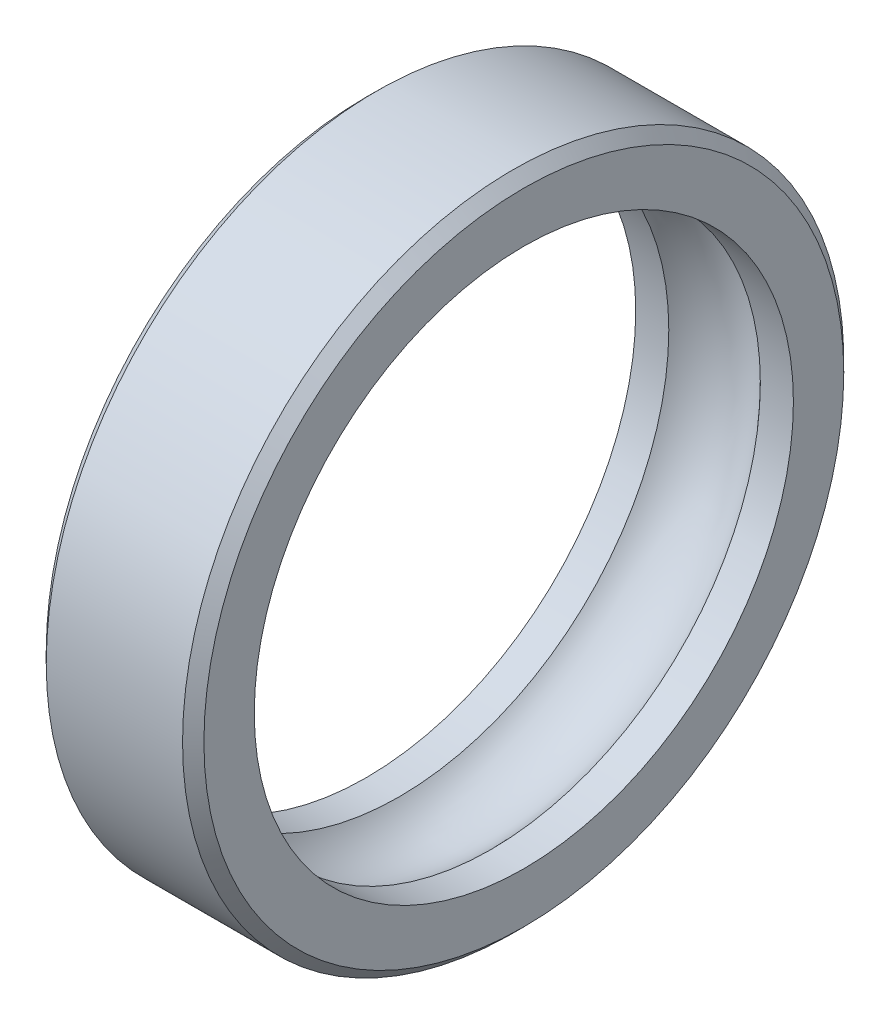
ISO-10303-21;
HEADER;
FILE_DESCRIPTION(('STEP AP214'),'2;1');
FILE_NAME('part.step','',(''),(''),'','','');
FILE_SCHEMA(('AUTOMOTIVE_DESIGN { 1 0 10303 214 1 1 1 1 }'));
ENDSEC;
DATA;
#1=APPLICATION_CONTEXT('core data for automotive mechanical design processes');
#2=APPLICATION_PROTOCOL_DEFINITION('international standard','automotive_design',2000,#1);
#3=PRODUCT_CONTEXT('',#1,'mechanical');
#4=PRODUCT('Part','Part','',(#3));
#5=PRODUCT_RELATED_PRODUCT_CATEGORY('part','',(#4));
#6=PRODUCT_DEFINITION_FORMATION('','',#4);
#7=PRODUCT_DEFINITION_CONTEXT('part definition',#1,'design');
#8=PRODUCT_DEFINITION('design','',#6,#7);
#9=PRODUCT_DEFINITION_SHAPE('','',#8);
#10=(LENGTH_UNIT() NAMED_UNIT(*) SI_UNIT(.MILLI.,.METRE.));
#11=(NAMED_UNIT(*) PLANE_ANGLE_UNIT() SI_UNIT($,.RADIAN.));
#12=(NAMED_UNIT(*) SI_UNIT($,.STERADIAN.) SOLID_ANGLE_UNIT());
#13=UNCERTAINTY_MEASURE_WITH_UNIT(LENGTH_MEASURE(1.E-05),#10,'distance_accuracy_value','');
#14=(GEOMETRIC_REPRESENTATION_CONTEXT(3) GLOBAL_UNCERTAINTY_ASSIGNED_CONTEXT((#13)) GLOBAL_UNIT_ASSIGNED_CONTEXT((#10,
#11,#12)) REPRESENTATION_CONTEXT('',''));
#15=CARTESIAN_POINT('',(0.,0.,0.));
#16=DIRECTION('',(0.,0.,1.));
#17=DIRECTION('',(1.,0.,0.));
#18=AXIS2_PLACEMENT_3D('',#15,#16,#17);
#19=CARTESIAN_POINT('',(-15.1704812516127,65.,0.));
#20=DIRECTION('',(1.,0.,0.));
#21=DIRECTION('',(0.,0.,-1.));
#22=AXIS2_PLACEMENT_3D('',#19,#20,#21);
#23=PLANE('',#22);
#24=CARTESIAN_POINT('',(-15.1704812516127,0.,0.));
#25=DIRECTION('',(1.,0.,0.));
#26=DIRECTION('',(0.,0.,-1.));
#27=AXIS2_PLACEMENT_3D('',#24,#25,#26);
#28=CIRCLE('',#27,62.9);
#29=CARTESIAN_POINT('',(-15.1704812516127,0.,-62.9));
#30=VERTEX_POINT('',#29);
#31=EDGE_CURVE('E10',#30,#30,#28,.F.);
#32=ORIENTED_EDGE('',*,*,#31,.T.);
#33=EDGE_LOOP('',(#32));
#34=FACE_BOUND('',#33,.T.);
#35=CARTESIAN_POINT('',(-15.1704812516127,0.,0.));
#36=DIRECTION('',(-1.,0.,0.));
#37=DIRECTION('',(0.,0.,1.));
#38=AXIS2_PLACEMENT_3D('',#35,#36,#37);
#39=CIRCLE('',#38,53.);
#40=CARTESIAN_POINT('',(-15.1704812516127,0.,53.));
#41=VERTEX_POINT('',#40);
#42=EDGE_CURVE('E68',#41,#41,#39,.T.);
#43=ORIENTED_EDGE('',*,*,#42,.F.);
#44=EDGE_LOOP('',(#43));
#45=FACE_BOUND('',#44,.T.);
#46=ADVANCED_FACE('F39',(#34,#45),#23,.F.);
#47=CARTESIAN_POINT('',(-8.51940617188541,0.,0.));
#48=DIRECTION('',(-1.,0.,0.));
#49=DIRECTION('',(0.,0.,1.));
#50=AXIS2_PLACEMENT_3D('',#47,#48,#49);
#51=CYLINDRICAL_SURFACE('',#50,65.);
#52=CARTESIAN_POINT('',(13.7295187483873,0.,0.));
#53=DIRECTION('',(-1.,0.,0.));
#54=DIRECTION('',(0.,0.,1.));
#55=AXIS2_PLACEMENT_3D('',#52,#53,#54);
#56=CIRCLE('',#55,65.);
#57=CARTESIAN_POINT('',(13.7295187483873,0.,65.));
#58=VERTEX_POINT('',#57);
#59=EDGE_CURVE('E50',#58,#58,#56,.T.);
#60=ORIENTED_EDGE('',*,*,#59,.T.);
#61=EDGE_LOOP('',(#60));
#62=FACE_BOUND('',#61,.T.);
#63=CARTESIAN_POINT('',(-13.0704812516127,0.,0.));
#64=DIRECTION('',(1.,0.,0.));
#65=DIRECTION('',(0.,0.,-1.));
#66=AXIS2_PLACEMENT_3D('',#63,#64,#65);
#67=CIRCLE('',#66,65.);
#68=CARTESIAN_POINT('',(-13.0704812516127,0.,-65.));
#69=VERTEX_POINT('',#68);
#70=EDGE_CURVE('E54',#69,#69,#67,.T.);
#71=ORIENTED_EDGE('',*,*,#70,.T.);
#72=EDGE_LOOP('',(#71));
#73=FACE_BOUND('',#72,.T.);
#74=ADVANCED_FACE('F75',(#62,#73),#51,.T.);
#75=CARTESIAN_POINT('',(15.8295187483873,65.,0.));
#76=DIRECTION('',(-1.,0.,0.));
#77=DIRECTION('',(0.,0.,1.));
#78=AXIS2_PLACEMENT_3D('',#75,#76,#77);
#79=PLANE('',#78);
#80=CARTESIAN_POINT('',(15.8295187483873,0.,0.));
#81=DIRECTION('',(-1.,0.,0.));
#82=DIRECTION('',(0.,0.,1.));
#83=AXIS2_PLACEMENT_3D('',#80,#81,#82);
#84=CIRCLE('',#83,62.9);
#85=CARTESIAN_POINT('',(15.8295187483873,0.,62.9));
#86=VERTEX_POINT('',#85);
#87=EDGE_CURVE('E46',#86,#86,#84,.F.);
#88=ORIENTED_EDGE('',*,*,#87,.T.);
#89=EDGE_LOOP('',(#88));
#90=FACE_BOUND('',#89,.T.);
#91=CARTESIAN_POINT('',(15.8295187483873,0.,0.));
#92=DIRECTION('',(-1.,0.,0.));
#93=DIRECTION('',(0.,0.,1.));
#94=AXIS2_PLACEMENT_3D('',#91,#92,#93);
#95=CIRCLE('',#94,53.);
#96=CARTESIAN_POINT('',(15.8295187483873,0.,53.));
#97=VERTEX_POINT('',#96);
#98=EDGE_CURVE('E59',#97,#97,#95,.T.);
#99=ORIENTED_EDGE('',*,*,#98,.T.);
#100=EDGE_LOOP('',(#99));
#101=FACE_BOUND('',#100,.T.);
#102=ADVANCED_FACE('F80',(#90,#101),#79,.F.);
#103=CARTESIAN_POINT('',(-8.51940617188541,0.,0.));
#104=DIRECTION('',(-1.,0.,0.));
#105=DIRECTION('',(0.,0.,1.));
#106=AXIS2_PLACEMENT_3D('',#103,#104,#105);
#107=CYLINDRICAL_SURFACE('',#106,53.);
#108=ORIENTED_EDGE('',*,*,#98,.F.);
#109=EDGE_LOOP('',(#108));
#110=FACE_BOUND('',#109,.T.);
#111=CARTESIAN_POINT('',(9.32951874838731,0.,0.));
#112=DIRECTION('',(-1.,0.,0.));
#113=DIRECTION('',(0.,0.,1.));
#114=AXIS2_PLACEMENT_3D('',#111,#112,#113);
#115=CIRCLE('',#114,53.);
#116=CARTESIAN_POINT('',(9.32951874838731,0.,53.));
#117=VERTEX_POINT('',#116);
#118=EDGE_CURVE('E62',#117,#117,#115,.T.);
#119=ORIENTED_EDGE('',*,*,#118,.T.);
#120=EDGE_LOOP('',(#119));
#121=FACE_BOUND('',#120,.T.);
#122=ADVANCED_FACE('F103',(#110,#121),#107,.F.);
#123=CARTESIAN_POINT('',(0.329518748387315,0.,0.));
#124=DIRECTION('',(-1.,0.,0.));
#125=DIRECTION('',(0.,0.,1.));
#126=AXIS2_PLACEMENT_3D('',#123,#124,#125);
#127=TOROIDAL_SURFACE('',#126,45.0627460668062,12.);
#128=ORIENTED_EDGE('',*,*,#118,.F.);
#129=EDGE_LOOP('',(#128));
#130=FACE_BOUND('',#129,.T.);
#131=CARTESIAN_POINT('',(-8.67048125161269,0.,0.));
#132=DIRECTION('',(-1.,0.,0.));
#133=DIRECTION('',(0.,0.,1.));
#134=AXIS2_PLACEMENT_3D('',#131,#132,#133);
#135=CIRCLE('',#134,53.);
#136=CARTESIAN_POINT('',(-8.67048125161269,0.,53.));
#137=VERTEX_POINT('',#136);
#138=EDGE_CURVE('E65',#137,#137,#135,.T.);
#139=ORIENTED_EDGE('',*,*,#138,.T.);
#140=EDGE_LOOP('',(#139));
#141=FACE_BOUND('',#140,.T.);
#142=ADVANCED_FACE('F92',(#130,#141),#127,.F.);
#143=CARTESIAN_POINT('',(-8.51940617188541,0.,0.));
#144=DIRECTION('',(-1.,0.,0.));
#145=DIRECTION('',(0.,0.,1.));
#146=AXIS2_PLACEMENT_3D('',#143,#144,#145);
#147=CYLINDRICAL_SURFACE('',#146,53.);
#148=ORIENTED_EDGE('',*,*,#138,.F.);
#149=EDGE_LOOP('',(#148));
#150=FACE_BOUND('',#149,.T.);
#151=ORIENTED_EDGE('',*,*,#42,.T.);
#152=EDGE_LOOP('',(#151));
#153=FACE_BOUND('',#152,.T.);
#154=ADVANCED_FACE('F72',(#150,#153),#147,.F.);
#155=CARTESIAN_POINT('',(13.7295187483873,0.,0.));
#156=DIRECTION('',(-1.,0.,0.));
#157=DIRECTION('',(0.,0.,1.));
#158=AXIS2_PLACEMENT_3D('',#155,#156,#157);
#159=CONICAL_SURFACE('',#158,65.,0.785398163397452);
#160=ORIENTED_EDGE('',*,*,#87,.F.);
#161=EDGE_LOOP('',(#160));
#162=FACE_BOUND('',#161,.T.);
#163=ORIENTED_EDGE('',*,*,#59,.F.);
#164=EDGE_LOOP('',(#163));
#165=FACE_BOUND('',#164,.T.);
#166=ADVANCED_FACE('F84',(#162,#165),#159,.T.);
#167=CARTESIAN_POINT('',(-15.1704812516127,0.,0.));
#168=DIRECTION('',(1.,0.,0.));
#169=DIRECTION('',(0.,0.,-1.));
#170=AXIS2_PLACEMENT_3D('',#167,#168,#169);
#171=CONICAL_SURFACE('',#170,62.9,0.785398163397445);
#172=ORIENTED_EDGE('',*,*,#70,.F.);
#173=EDGE_LOOP('',(#172));
#174=FACE_BOUND('',#173,.T.);
#175=ORIENTED_EDGE('',*,*,#31,.F.);
#176=EDGE_LOOP('',(#175));
#177=FACE_BOUND('',#176,.T.);
#178=ADVANCED_FACE('F41',(#174,#177),#171,.T.);
#179=CLOSED_SHELL('',(#46,#74,#102,#122,#142,#154,#166,#178));
#180=MANIFOLD_SOLID_BREP('B2',#179);
#181=ADVANCED_BREP_SHAPE_REPRESENTATION('',(#18,#180),#14);
#182=SHAPE_DEFINITION_REPRESENTATION(#9,#181);
ENDSEC;
END-ISO-10303-21;
